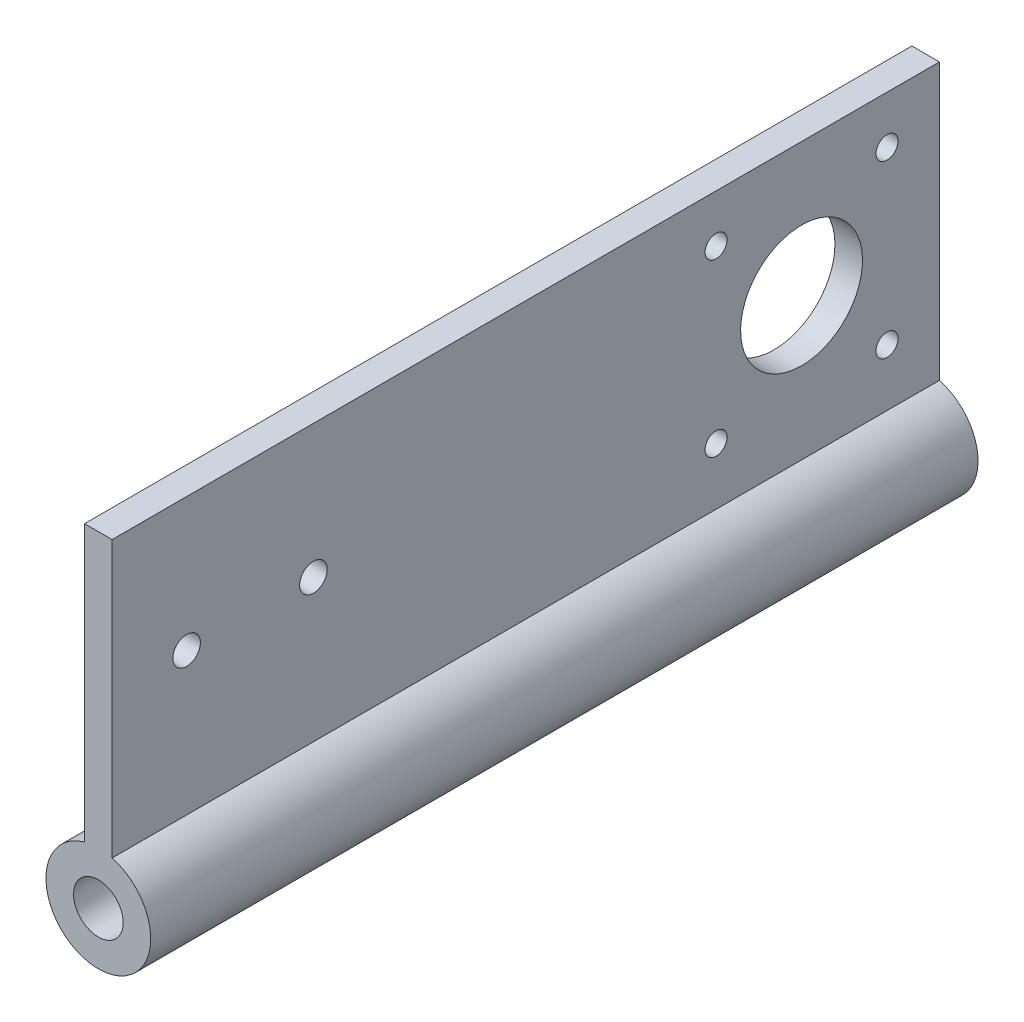
ISO-10303-21;
HEADER;
FILE_DESCRIPTION(('STEP AP214'),'2;1');
FILE_NAME('part.step','',(''),(''),'','','');
FILE_SCHEMA(('AUTOMOTIVE_DESIGN { 1 0 10303 214 1 1 1 1 }'));
ENDSEC;
DATA;
#1=APPLICATION_CONTEXT('core data for automotive mechanical design processes');
#2=APPLICATION_PROTOCOL_DEFINITION('international standard','automotive_design',2000,#1);
#3=PRODUCT_CONTEXT('',#1,'mechanical');
#4=PRODUCT('Part','Part','',(#3));
#5=PRODUCT_RELATED_PRODUCT_CATEGORY('part','',(#4));
#6=PRODUCT_DEFINITION_FORMATION('','',#4);
#7=PRODUCT_DEFINITION_CONTEXT('part definition',#1,'design');
#8=PRODUCT_DEFINITION('design','',#6,#7);
#9=PRODUCT_DEFINITION_SHAPE('','',#8);
#10=(LENGTH_UNIT() NAMED_UNIT(*) SI_UNIT(.MILLI.,.METRE.));
#11=(NAMED_UNIT(*) PLANE_ANGLE_UNIT() SI_UNIT($,.RADIAN.));
#12=(NAMED_UNIT(*) SI_UNIT($,.STERADIAN.) SOLID_ANGLE_UNIT());
#13=UNCERTAINTY_MEASURE_WITH_UNIT(LENGTH_MEASURE(1.E-05),#10,'distance_accuracy_value','');
#14=(GEOMETRIC_REPRESENTATION_CONTEXT(3) GLOBAL_UNCERTAINTY_ASSIGNED_CONTEXT((#13)) GLOBAL_UNIT_ASSIGNED_CONTEXT((#10,
#11,#12)) REPRESENTATION_CONTEXT('',''));
#15=CARTESIAN_POINT('',(0.,0.,0.));
#16=DIRECTION('',(0.,0.,1.));
#17=DIRECTION('',(1.,0.,0.));
#18=AXIS2_PLACEMENT_3D('',#15,#16,#17);
#19=CARTESIAN_POINT('',(0.,0.,150.));
#20=DIRECTION('',(0.,0.,1.));
#21=DIRECTION('',(1.,0.,0.));
#22=AXIS2_PLACEMENT_3D('',#19,#20,#21);
#23=PLANE('',#22);
#24=DIRECTION('',(-1.,0.,0.));
#25=VECTOR('',#24,1.);
#26=CARTESIAN_POINT('',(-2.50000000000001,59.1651513899117,150.));
#27=LINE('',#26,#25);
#28=CARTESIAN_POINT('',(2.49999999999999,59.1651513899117,150.));
#29=VERTEX_POINT('',#28);
#30=CARTESIAN_POINT('',(-2.50000000000001,59.1651513899117,150.));
#31=VERTEX_POINT('',#30);
#32=EDGE_CURVE('E94',#29,#31,#27,.T.);
#33=ORIENTED_EDGE('',*,*,#32,.T.);
#34=DIRECTION('',(0.,-1.,0.));
#35=VECTOR('',#34,1.);
#36=CARTESIAN_POINT('',(-2.50000000000001,59.1651513899117,150.));
#37=LINE('',#36,#35);
#38=CARTESIAN_POINT('',(-2.5,9.16515138991168,150.));
#39=VERTEX_POINT('',#38);
#40=EDGE_CURVE('E89',#31,#39,#37,.T.);
#41=ORIENTED_EDGE('',*,*,#40,.T.);
#42=CARTESIAN_POINT('',(0.,0.,150.));
#43=DIRECTION('',(0.,0.,1.));
#44=DIRECTION('',(1.,0.,0.));
#45=AXIS2_PLACEMENT_3D('',#42,#43,#44);
#46=CIRCLE('',#45,9.5);
#47=CARTESIAN_POINT('',(2.5,9.16515138991168,150.));
#48=VERTEX_POINT('',#47);
#49=EDGE_CURVE('E92',#39,#48,#46,.T.);
#50=ORIENTED_EDGE('',*,*,#49,.T.);
#51=DIRECTION('',(0.,1.,0.));
#52=VECTOR('',#51,1.);
#53=CARTESIAN_POINT('',(2.49999999999999,59.1651513899117,150.));
#54=LINE('',#53,#52);
#55=EDGE_CURVE('E59',#48,#29,#54,.T.);
#56=ORIENTED_EDGE('',*,*,#55,.T.);
#57=EDGE_LOOP('',(#33,#41,#50,#56));
#58=FACE_BOUND('',#57,.T.);
#59=CARTESIAN_POINT('',(0.,0.,150.));
#60=DIRECTION('',(0.,0.,1.));
#61=DIRECTION('',(1.,0.,0.));
#62=AXIS2_PLACEMENT_3D('',#59,#60,#61);
#63=CIRCLE('',#62,4.5);
#64=CARTESIAN_POINT('',(4.5,0.,150.));
#65=VERTEX_POINT('',#64);
#66=EDGE_CURVE('E115',#65,#65,#63,.T.);
#67=ORIENTED_EDGE('',*,*,#66,.F.);
#68=EDGE_LOOP('',(#67));
#69=FACE_BOUND('',#68,.T.);
#70=ADVANCED_FACE('F39',(#58,#69),#23,.T.);
#71=CARTESIAN_POINT('',(0.,0.,0.));
#72=DIRECTION('',(0.,0.,1.));
#73=DIRECTION('',(1.,0.,0.));
#74=AXIS2_PLACEMENT_3D('',#71,#72,#73);
#75=PLANE('',#74);
#76=DIRECTION('',(-1.,0.,0.));
#77=VECTOR('',#76,1.);
#78=CARTESIAN_POINT('',(-2.50000000000001,59.1651513899117,0.));
#79=LINE('',#78,#77);
#80=CARTESIAN_POINT('',(2.49999999999999,59.1651513899117,0.));
#81=VERTEX_POINT('',#80);
#82=CARTESIAN_POINT('',(-2.50000000000001,59.1651513899117,0.));
#83=VERTEX_POINT('',#82);
#84=EDGE_CURVE('E111',#81,#83,#79,.T.);
#85=ORIENTED_EDGE('',*,*,#84,.F.);
#86=DIRECTION('',(0.,1.,0.));
#87=VECTOR('',#86,1.);
#88=CARTESIAN_POINT('',(2.49999999999999,59.1651513899117,0.));
#89=LINE('',#88,#87);
#90=CARTESIAN_POINT('',(2.5,9.16515138991168,0.));
#91=VERTEX_POINT('',#90);
#92=EDGE_CURVE('E82',#91,#81,#89,.T.);
#93=ORIENTED_EDGE('',*,*,#92,.F.);
#94=CARTESIAN_POINT('',(0.,0.,0.));
#95=DIRECTION('',(0.,0.,1.));
#96=DIRECTION('',(1.,0.,0.));
#97=AXIS2_PLACEMENT_3D('',#94,#95,#96);
#98=CIRCLE('',#97,9.5);
#99=CARTESIAN_POINT('',(-2.5,9.16515138991168,0.));
#100=VERTEX_POINT('',#99);
#101=EDGE_CURVE('E76',#100,#91,#98,.T.);
#102=ORIENTED_EDGE('',*,*,#101,.F.);
#103=DIRECTION('',(0.,-1.,0.));
#104=VECTOR('',#103,1.);
#105=CARTESIAN_POINT('',(-2.50000000000001,59.1651513899117,0.));
#106=LINE('',#105,#104);
#107=EDGE_CURVE('E99',#83,#100,#106,.T.);
#108=ORIENTED_EDGE('',*,*,#107,.F.);
#109=EDGE_LOOP('',(#85,#93,#102,#108));
#110=FACE_BOUND('',#109,.T.);
#111=CARTESIAN_POINT('',(0.,0.,0.));
#112=DIRECTION('',(0.,0.,1.));
#113=DIRECTION('',(1.,0.,0.));
#114=AXIS2_PLACEMENT_3D('',#111,#112,#113);
#115=CIRCLE('',#114,4.5);
#116=CARTESIAN_POINT('',(4.5,0.,0.));
#117=VERTEX_POINT('',#116);
#118=EDGE_CURVE('E146',#117,#117,#115,.T.);
#119=ORIENTED_EDGE('',*,*,#118,.T.);
#120=EDGE_LOOP('',(#119));
#121=FACE_BOUND('',#120,.T.);
#122=ADVANCED_FACE('F192',(#110,#121),#75,.F.);
#123=CARTESIAN_POINT('',(-2.50000000000001,59.1651513899117,150.));
#124=DIRECTION('',(0.,-1.,0.));
#125=DIRECTION('',(0.,0.,-1.));
#126=AXIS2_PLACEMENT_3D('',#123,#124,#125);
#127=PLANE('',#126);
#128=ORIENTED_EDGE('',*,*,#84,.T.);
#129=DIRECTION('',(0.,0.,-1.));
#130=VECTOR('',#129,1.);
#131=CARTESIAN_POINT('',(-2.50000000000001,59.1651513899117,150.));
#132=LINE('',#131,#130);
#133=EDGE_CURVE('E11',#31,#83,#132,.T.);
#134=ORIENTED_EDGE('',*,*,#133,.F.);
#135=ORIENTED_EDGE('',*,*,#32,.F.);
#136=DIRECTION('',(0.,0.,-1.));
#137=VECTOR('',#136,1.);
#138=CARTESIAN_POINT('',(2.49999999999999,59.1651513899117,150.));
#139=LINE('',#138,#137);
#140=EDGE_CURVE('E107',#29,#81,#139,.T.);
#141=ORIENTED_EDGE('',*,*,#140,.T.);
#142=EDGE_LOOP('',(#128,#134,#135,#141));
#143=FACE_BOUND('',#142,.T.);
#144=ADVANCED_FACE('F41',(#143),#127,.F.);
#145=CARTESIAN_POINT('',(-2.50000000000001,59.1651513899117,150.));
#146=DIRECTION('',(1.,0.,0.));
#147=DIRECTION('',(0.,1.,0.));
#148=AXIS2_PLACEMENT_3D('',#145,#146,#147);
#149=PLANE('',#148);
#150=CARTESIAN_POINT('',(-2.5,35.,113.5));
#151=DIRECTION('',(-1.,0.,0.));
#152=DIRECTION('',(0.,-1.,0.));
#153=AXIS2_PLACEMENT_3D('',#150,#151,#152);
#154=CIRCLE('',#153,2.50000000000001);
#155=CARTESIAN_POINT('',(-2.5,32.5,113.5));
#156=VERTEX_POINT('',#155);
#157=EDGE_CURVE('E150',#156,#156,#154,.T.);
#158=ORIENTED_EDGE('',*,*,#157,.F.);
#159=EDGE_LOOP('',(#158));
#160=FACE_BOUND('',#159,.T.);
#161=CARTESIAN_POINT('',(-2.5,35.,136.5));
#162=DIRECTION('',(-1.,0.,0.));
#163=DIRECTION('',(0.,-1.,0.));
#164=AXIS2_PLACEMENT_3D('',#161,#162,#163);
#165=CIRCLE('',#164,2.5);
#166=CARTESIAN_POINT('',(-2.5,32.5,136.5));
#167=VERTEX_POINT('',#166);
#168=EDGE_CURVE('E158',#167,#167,#165,.T.);
#169=ORIENTED_EDGE('',*,*,#168,.F.);
#170=EDGE_LOOP('',(#169));
#171=FACE_BOUND('',#170,.T.);
#172=CARTESIAN_POINT('',(-2.5,35.,25.));
#173=DIRECTION('',(-1.,0.,0.));
#174=DIRECTION('',(0.,-1.,0.));
#175=AXIS2_PLACEMENT_3D('',#172,#173,#174);
#176=CIRCLE('',#175,11.05);
#177=CARTESIAN_POINT('',(-2.5,23.95,25.));
#178=VERTEX_POINT('',#177);
#179=EDGE_CURVE('E156',#178,#178,#176,.T.);
#180=ORIENTED_EDGE('',*,*,#179,.F.);
#181=EDGE_LOOP('',(#180));
#182=FACE_BOUND('',#181,.T.);
#183=CARTESIAN_POINT('',(-2.5,19.5,9.5));
#184=DIRECTION('',(-1.,0.,0.));
#185=DIRECTION('',(0.,-1.,0.));
#186=AXIS2_PLACEMENT_3D('',#183,#184,#185);
#187=CIRCLE('',#186,2.);
#188=CARTESIAN_POINT('',(-2.5,17.5,9.5));
#189=VERTEX_POINT('',#188);
#190=EDGE_CURVE('E174',#189,#189,#187,.T.);
#191=ORIENTED_EDGE('',*,*,#190,.F.);
#192=EDGE_LOOP('',(#191));
#193=FACE_BOUND('',#192,.T.);
#194=CARTESIAN_POINT('',(-2.5,19.5,40.5));
#195=DIRECTION('',(-1.,0.,0.));
#196=DIRECTION('',(0.,-1.,0.));
#197=AXIS2_PLACEMENT_3D('',#194,#195,#196);
#198=CIRCLE('',#197,2.);
#199=CARTESIAN_POINT('',(-2.5,17.5,40.5));
#200=VERTEX_POINT('',#199);
#201=EDGE_CURVE('E170',#200,#200,#198,.T.);
#202=ORIENTED_EDGE('',*,*,#201,.F.);
#203=EDGE_LOOP('',(#202));
#204=FACE_BOUND('',#203,.T.);
#205=CARTESIAN_POINT('',(-2.5,50.5,40.5));
#206=DIRECTION('',(-1.,0.,0.));
#207=DIRECTION('',(0.,-1.,0.));
#208=AXIS2_PLACEMENT_3D('',#205,#206,#207);
#209=CIRCLE('',#208,2.);
#210=CARTESIAN_POINT('',(-2.5,48.5,40.5));
#211=VERTEX_POINT('',#210);
#212=EDGE_CURVE('E166',#211,#211,#209,.T.);
#213=ORIENTED_EDGE('',*,*,#212,.F.);
#214=EDGE_LOOP('',(#213));
#215=FACE_BOUND('',#214,.T.);
#216=CARTESIAN_POINT('',(-2.5,50.5,9.5));
#217=DIRECTION('',(-1.,0.,0.));
#218=DIRECTION('',(0.,-1.,0.));
#219=AXIS2_PLACEMENT_3D('',#216,#217,#218);
#220=CIRCLE('',#219,2.);
#221=CARTESIAN_POINT('',(-2.5,48.5,9.5));
#222=VERTEX_POINT('',#221);
#223=EDGE_CURVE('E131',#222,#222,#220,.T.);
#224=ORIENTED_EDGE('',*,*,#223,.F.);
#225=EDGE_LOOP('',(#224));
#226=FACE_BOUND('',#225,.T.);
#227=ORIENTED_EDGE('',*,*,#107,.T.);
#228=DIRECTION('',(0.,0.,-1.));
#229=VECTOR('',#228,1.);
#230=CARTESIAN_POINT('',(-2.5,9.16515138991168,150.));
#231=LINE('',#230,#229);
#232=EDGE_CURVE('E50',#39,#100,#231,.T.);
#233=ORIENTED_EDGE('',*,*,#232,.F.);
#234=ORIENTED_EDGE('',*,*,#40,.F.);
#235=ORIENTED_EDGE('',*,*,#133,.T.);
#236=EDGE_LOOP('',(#227,#233,#234,#235));
#237=FACE_BOUND('',#236,.T.);
#238=ADVANCED_FACE('F98',(#160,#171,#182,#193,#204,#215,#226,#237),#149,.F.);
#239=CARTESIAN_POINT('',(0.,0.,150.));
#240=DIRECTION('',(0.,0.,-1.));
#241=DIRECTION('',(-1.,0.,0.));
#242=AXIS2_PLACEMENT_3D('',#239,#240,#241);
#243=CYLINDRICAL_SURFACE('',#242,9.5);
#244=ORIENTED_EDGE('',*,*,#101,.T.);
#245=DIRECTION('',(0.,0.,-1.));
#246=VECTOR('',#245,1.);
#247=CARTESIAN_POINT('',(2.5,9.16515138991168,150.));
#248=LINE('',#247,#246);
#249=EDGE_CURVE('E101',#48,#91,#248,.T.);
#250=ORIENTED_EDGE('',*,*,#249,.F.);
#251=ORIENTED_EDGE('',*,*,#49,.F.);
#252=ORIENTED_EDGE('',*,*,#232,.T.);
#253=EDGE_LOOP('',(#244,#250,#251,#252));
#254=FACE_BOUND('',#253,.T.);
#255=ADVANCED_FACE('F103',(#254),#243,.T.);
#256=CARTESIAN_POINT('',(2.49999999999999,59.1651513899117,150.));
#257=DIRECTION('',(-1.,0.,0.));
#258=DIRECTION('',(0.,-1.,0.));
#259=AXIS2_PLACEMENT_3D('',#256,#257,#258);
#260=PLANE('',#259);
#261=CARTESIAN_POINT('',(2.5,35.,113.5));
#262=DIRECTION('',(-1.,0.,0.));
#263=DIRECTION('',(0.,-1.,0.));
#264=AXIS2_PLACEMENT_3D('',#261,#262,#263);
#265=CIRCLE('',#264,2.50000000000001);
#266=CARTESIAN_POINT('',(2.5,32.5,113.5));
#267=VERTEX_POINT('',#266);
#268=EDGE_CURVE('E43',#267,#267,#265,.T.);
#269=ORIENTED_EDGE('',*,*,#268,.T.);
#270=EDGE_LOOP('',(#269));
#271=FACE_BOUND('',#270,.T.);
#272=CARTESIAN_POINT('',(2.5,35.,136.5));
#273=DIRECTION('',(-1.,0.,0.));
#274=DIRECTION('',(0.,-1.,0.));
#275=AXIS2_PLACEMENT_3D('',#272,#273,#274);
#276=CIRCLE('',#275,2.5);
#277=CARTESIAN_POINT('',(2.5,32.5,136.5));
#278=VERTEX_POINT('',#277);
#279=EDGE_CURVE('E147',#278,#278,#276,.T.);
#280=ORIENTED_EDGE('',*,*,#279,.T.);
#281=EDGE_LOOP('',(#280));
#282=FACE_BOUND('',#281,.T.);
#283=CARTESIAN_POINT('',(2.5,35.,25.));
#284=DIRECTION('',(-1.,0.,0.));
#285=DIRECTION('',(0.,-1.,0.));
#286=AXIS2_PLACEMENT_3D('',#283,#284,#285);
#287=CIRCLE('',#286,11.05);
#288=CARTESIAN_POINT('',(2.5,23.95,25.));
#289=VERTEX_POINT('',#288);
#290=EDGE_CURVE('E143',#289,#289,#287,.T.);
#291=ORIENTED_EDGE('',*,*,#290,.T.);
#292=EDGE_LOOP('',(#291));
#293=FACE_BOUND('',#292,.T.);
#294=CARTESIAN_POINT('',(2.5,19.5,9.5));
#295=DIRECTION('',(-1.,0.,0.));
#296=DIRECTION('',(0.,-1.,0.));
#297=AXIS2_PLACEMENT_3D('',#294,#295,#296);
#298=CIRCLE('',#297,2.);
#299=CARTESIAN_POINT('',(2.5,17.5,9.5));
#300=VERTEX_POINT('',#299);
#301=EDGE_CURVE('E139',#300,#300,#298,.T.);
#302=ORIENTED_EDGE('',*,*,#301,.T.);
#303=EDGE_LOOP('',(#302));
#304=FACE_BOUND('',#303,.T.);
#305=CARTESIAN_POINT('',(2.5,19.5,40.5));
#306=DIRECTION('',(-1.,0.,0.));
#307=DIRECTION('',(0.,-1.,0.));
#308=AXIS2_PLACEMENT_3D('',#305,#306,#307);
#309=CIRCLE('',#308,2.);
#310=CARTESIAN_POINT('',(2.5,17.5,40.5));
#311=VERTEX_POINT('',#310);
#312=EDGE_CURVE('E135',#311,#311,#309,.T.);
#313=ORIENTED_EDGE('',*,*,#312,.T.);
#314=EDGE_LOOP('',(#313));
#315=FACE_BOUND('',#314,.T.);
#316=CARTESIAN_POINT('',(2.49999999999999,50.5,40.5));
#317=DIRECTION('',(-1.,0.,0.));
#318=DIRECTION('',(0.,-1.,0.));
#319=AXIS2_PLACEMENT_3D('',#316,#317,#318);
#320=CIRCLE('',#319,2.);
#321=CARTESIAN_POINT('',(2.49999999999999,48.5,40.5));
#322=VERTEX_POINT('',#321);
#323=EDGE_CURVE('E130',#322,#322,#320,.T.);
#324=ORIENTED_EDGE('',*,*,#323,.T.);
#325=EDGE_LOOP('',(#324));
#326=FACE_BOUND('',#325,.T.);
#327=CARTESIAN_POINT('',(2.49999999999999,50.5,9.5));
#328=DIRECTION('',(-1.,0.,0.));
#329=DIRECTION('',(0.,-1.,0.));
#330=AXIS2_PLACEMENT_3D('',#327,#328,#329);
#331=CIRCLE('',#330,2.);
#332=CARTESIAN_POINT('',(2.49999999999999,48.5,9.5));
#333=VERTEX_POINT('',#332);
#334=EDGE_CURVE('E126',#333,#333,#331,.T.);
#335=ORIENTED_EDGE('',*,*,#334,.T.);
#336=EDGE_LOOP('',(#335));
#337=FACE_BOUND('',#336,.T.);
#338=ORIENTED_EDGE('',*,*,#92,.T.);
#339=ORIENTED_EDGE('',*,*,#140,.F.);
#340=ORIENTED_EDGE('',*,*,#55,.F.);
#341=ORIENTED_EDGE('',*,*,#249,.T.);
#342=EDGE_LOOP('',(#338,#339,#340,#341));
#343=FACE_BOUND('',#342,.T.);
#344=ADVANCED_FACE('F197',(#271,#282,#293,#304,#315,#326,#337,#343),#260,.F.);
#345=CARTESIAN_POINT('',(0.,0.,150.));
#346=DIRECTION('',(0.,0.,-1.));
#347=DIRECTION('',(-1.,0.,0.));
#348=AXIS2_PLACEMENT_3D('',#345,#346,#347);
#349=CYLINDRICAL_SURFACE('',#348,4.5);
#350=ORIENTED_EDGE('',*,*,#66,.T.);
#351=EDGE_LOOP('',(#350));
#352=FACE_BOUND('',#351,.T.);
#353=ORIENTED_EDGE('',*,*,#118,.F.);
#354=EDGE_LOOP('',(#353));
#355=FACE_BOUND('',#354,.T.);
#356=ADVANCED_FACE('F194',(#352,#355),#349,.F.);
#357=CARTESIAN_POINT('',(9.5,50.5,9.5));
#358=DIRECTION('',(-1.,0.,0.));
#359=DIRECTION('',(0.,-1.,0.));
#360=AXIS2_PLACEMENT_3D('',#357,#358,#359);
#361=CYLINDRICAL_SURFACE('',#360,2.);
#362=ORIENTED_EDGE('',*,*,#223,.T.);
#363=EDGE_LOOP('',(#362));
#364=FACE_BOUND('',#363,.T.);
#365=ORIENTED_EDGE('',*,*,#334,.F.);
#366=EDGE_LOOP('',(#365));
#367=FACE_BOUND('',#366,.T.);
#368=ADVANCED_FACE('F196',(#364,#367),#361,.F.);
#369=CARTESIAN_POINT('',(9.5,50.5,40.5));
#370=DIRECTION('',(-1.,0.,0.));
#371=DIRECTION('',(0.,-1.,0.));
#372=AXIS2_PLACEMENT_3D('',#369,#370,#371);
#373=CYLINDRICAL_SURFACE('',#372,2.);
#374=ORIENTED_EDGE('',*,*,#212,.T.);
#375=EDGE_LOOP('',(#374));
#376=FACE_BOUND('',#375,.T.);
#377=ORIENTED_EDGE('',*,*,#323,.F.);
#378=EDGE_LOOP('',(#377));
#379=FACE_BOUND('',#378,.T.);
#380=ADVANCED_FACE('F204',(#376,#379),#373,.F.);
#381=CARTESIAN_POINT('',(9.50000000000001,19.5,40.5));
#382=DIRECTION('',(-1.,0.,0.));
#383=DIRECTION('',(0.,-1.,0.));
#384=AXIS2_PLACEMENT_3D('',#381,#382,#383);
#385=CYLINDRICAL_SURFACE('',#384,2.);
#386=ORIENTED_EDGE('',*,*,#201,.T.);
#387=EDGE_LOOP('',(#386));
#388=FACE_BOUND('',#387,.T.);
#389=ORIENTED_EDGE('',*,*,#312,.F.);
#390=EDGE_LOOP('',(#389));
#391=FACE_BOUND('',#390,.T.);
#392=ADVANCED_FACE('F242',(#388,#391),#385,.F.);
#393=CARTESIAN_POINT('',(9.50000000000001,19.5,9.5));
#394=DIRECTION('',(-1.,0.,0.));
#395=DIRECTION('',(0.,-1.,0.));
#396=AXIS2_PLACEMENT_3D('',#393,#394,#395);
#397=CYLINDRICAL_SURFACE('',#396,2.);
#398=ORIENTED_EDGE('',*,*,#190,.T.);
#399=EDGE_LOOP('',(#398));
#400=FACE_BOUND('',#399,.T.);
#401=ORIENTED_EDGE('',*,*,#301,.F.);
#402=EDGE_LOOP('',(#401));
#403=FACE_BOUND('',#402,.T.);
#404=ADVANCED_FACE('F249',(#400,#403),#397,.F.);
#405=CARTESIAN_POINT('',(9.5,35.,25.));
#406=DIRECTION('',(-1.,0.,0.));
#407=DIRECTION('',(0.,-1.,0.));
#408=AXIS2_PLACEMENT_3D('',#405,#406,#407);
#409=CYLINDRICAL_SURFACE('',#408,11.05);
#410=ORIENTED_EDGE('',*,*,#179,.T.);
#411=EDGE_LOOP('',(#410));
#412=FACE_BOUND('',#411,.T.);
#413=ORIENTED_EDGE('',*,*,#290,.F.);
#414=EDGE_LOOP('',(#413));
#415=FACE_BOUND('',#414,.T.);
#416=ADVANCED_FACE('F258',(#412,#415),#409,.F.);
#417=CARTESIAN_POINT('',(9.5,35.,136.5));
#418=DIRECTION('',(-1.,0.,0.));
#419=DIRECTION('',(0.,-1.,0.));
#420=AXIS2_PLACEMENT_3D('',#417,#418,#419);
#421=CYLINDRICAL_SURFACE('',#420,2.5);
#422=ORIENTED_EDGE('',*,*,#168,.T.);
#423=EDGE_LOOP('',(#422));
#424=FACE_BOUND('',#423,.T.);
#425=ORIENTED_EDGE('',*,*,#279,.F.);
#426=EDGE_LOOP('',(#425));
#427=FACE_BOUND('',#426,.T.);
#428=ADVANCED_FACE('F253',(#424,#427),#421,.F.);
#429=CARTESIAN_POINT('',(9.5,35.,113.5));
#430=DIRECTION('',(-1.,0.,0.));
#431=DIRECTION('',(0.,-1.,0.));
#432=AXIS2_PLACEMENT_3D('',#429,#430,#431);
#433=CYLINDRICAL_SURFACE('',#432,2.50000000000001);
#434=ORIENTED_EDGE('',*,*,#157,.T.);
#435=EDGE_LOOP('',(#434));
#436=FACE_BOUND('',#435,.T.);
#437=ORIENTED_EDGE('',*,*,#268,.F.);
#438=EDGE_LOOP('',(#437));
#439=FACE_BOUND('',#438,.T.);
#440=ADVANCED_FACE('F265',(#436,#439),#433,.F.);
#441=CLOSED_SHELL('',(#70,#122,#144,#238,#255,#344,#356,#368,#380,#392,#404,#416,#428,#440));
#442=MANIFOLD_SOLID_BREP('B2',#441);
#443=ADVANCED_BREP_SHAPE_REPRESENTATION('',(#18,#442),#14);
#444=SHAPE_DEFINITION_REPRESENTATION(#9,#443);
ENDSEC;
END-ISO-10303-21;
